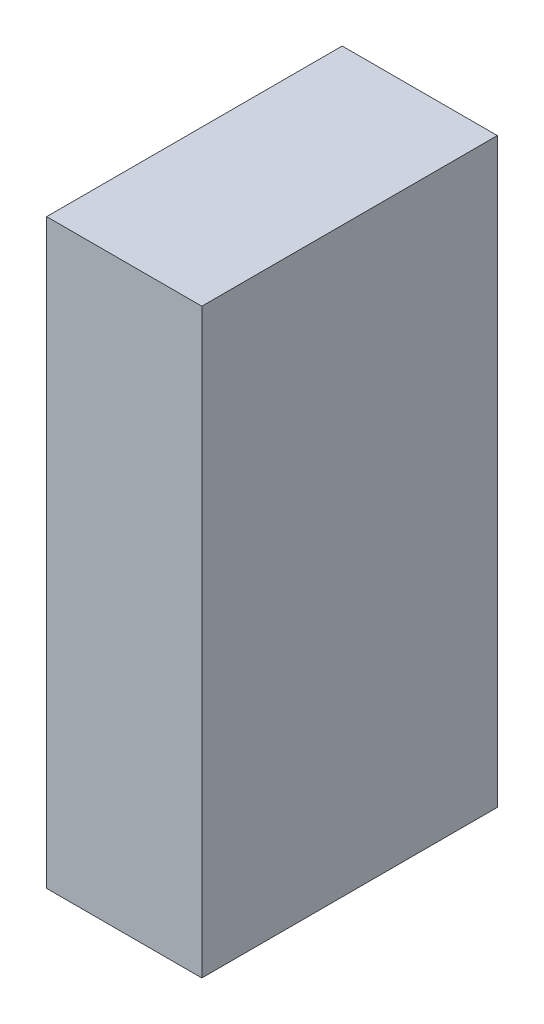
ISO-10303-21;
HEADER;
FILE_DESCRIPTION(('STEP AP214'),'2;1');
FILE_NAME('part.step','',(''),(''),'','','');
FILE_SCHEMA(('AUTOMOTIVE_DESIGN { 1 0 10303 214 1 1 1 1 }'));
ENDSEC;
DATA;
#1=APPLICATION_CONTEXT('core data for automotive mechanical design processes');
#2=APPLICATION_PROTOCOL_DEFINITION('international standard','automotive_design',2000,#1);
#3=PRODUCT_CONTEXT('',#1,'mechanical');
#4=PRODUCT('Part','Part','',(#3));
#5=PRODUCT_RELATED_PRODUCT_CATEGORY('part','',(#4));
#6=PRODUCT_DEFINITION_FORMATION('','',#4);
#7=PRODUCT_DEFINITION_CONTEXT('part definition',#1,'design');
#8=PRODUCT_DEFINITION('design','',#6,#7);
#9=PRODUCT_DEFINITION_SHAPE('','',#8);
#10=(LENGTH_UNIT() NAMED_UNIT(*) SI_UNIT(.MILLI.,.METRE.));
#11=(NAMED_UNIT(*) PLANE_ANGLE_UNIT() SI_UNIT($,.RADIAN.));
#12=(NAMED_UNIT(*) SI_UNIT($,.STERADIAN.) SOLID_ANGLE_UNIT());
#13=UNCERTAINTY_MEASURE_WITH_UNIT(LENGTH_MEASURE(1.E-05),#10,'distance_accuracy_value','');
#14=(GEOMETRIC_REPRESENTATION_CONTEXT(3) GLOBAL_UNCERTAINTY_ASSIGNED_CONTEXT((#13)) GLOBAL_UNIT_ASSIGNED_CONTEXT((#10,
#11,#12)) REPRESENTATION_CONTEXT('',''));
#15=CARTESIAN_POINT('',(0.,0.,0.));
#16=DIRECTION('',(0.,0.,1.));
#17=DIRECTION('',(1.,0.,0.));
#18=AXIS2_PLACEMENT_3D('',#15,#16,#17);
#19=CARTESIAN_POINT('',(0.,150.,0.));
#20=DIRECTION('',(1.,0.,0.));
#21=DIRECTION('',(0.,0.,-1.));
#22=AXIS2_PLACEMENT_3D('',#19,#20,#21);
#23=PLANE('',#22);
#24=DIRECTION('',(0.,0.,1.));
#25=VECTOR('',#24,1.);
#26=CARTESIAN_POINT('',(0.,0.,0.));
#27=LINE('',#26,#25);
#28=CARTESIAN_POINT('',(0.,0.,0.));
#29=VERTEX_POINT('',#28);
#30=CARTESIAN_POINT('',(0.,0.,76.2));
#31=VERTEX_POINT('',#30);
#32=EDGE_CURVE('E97',#29,#31,#27,.T.);
#33=ORIENTED_EDGE('',*,*,#32,.T.);
#34=DIRECTION('',(0.,-1.,0.));
#35=VECTOR('',#34,1.);
#36=CARTESIAN_POINT('',(0.,150.,76.2));
#37=LINE('',#36,#35);
#38=CARTESIAN_POINT('',(0.,150.,76.2));
#39=VERTEX_POINT('',#38);
#40=EDGE_CURVE('E11',#39,#31,#37,.T.);
#41=ORIENTED_EDGE('',*,*,#40,.F.);
#42=DIRECTION('',(0.,0.,1.));
#43=VECTOR('',#42,1.);
#44=CARTESIAN_POINT('',(0.,150.,0.));
#45=LINE('',#44,#43);
#46=CARTESIAN_POINT('',(0.,150.,0.));
#47=VERTEX_POINT('',#46);
#48=EDGE_CURVE('E85',#47,#39,#45,.T.);
#49=ORIENTED_EDGE('',*,*,#48,.F.);
#50=DIRECTION('',(0.,-1.,0.));
#51=VECTOR('',#50,1.);
#52=CARTESIAN_POINT('',(0.,150.,0.));
#53=LINE('',#52,#51);
#54=EDGE_CURVE('E93',#47,#29,#53,.T.);
#55=ORIENTED_EDGE('',*,*,#54,.T.);
#56=EDGE_LOOP('',(#33,#41,#49,#55));
#57=FACE_BOUND('',#56,.T.);
#58=ADVANCED_FACE('F34',(#57),#23,.F.);
#59=CARTESIAN_POINT('',(0.,150.,76.2));
#60=DIRECTION('',(0.,0.,-1.));
#61=DIRECTION('',(-1.,0.,0.));
#62=AXIS2_PLACEMENT_3D('',#59,#60,#61);
#63=PLANE('',#62);
#64=DIRECTION('',(1.,0.,0.));
#65=VECTOR('',#64,1.);
#66=CARTESIAN_POINT('',(0.,0.,76.2));
#67=LINE('',#66,#65);
#68=CARTESIAN_POINT('',(40.,0.,76.2));
#69=VERTEX_POINT('',#68);
#70=EDGE_CURVE('E89',#31,#69,#67,.T.);
#71=ORIENTED_EDGE('',*,*,#70,.T.);
#72=DIRECTION('',(0.,-1.,0.));
#73=VECTOR('',#72,1.);
#74=CARTESIAN_POINT('',(40.,150.,76.2));
#75=LINE('',#74,#73);
#76=CARTESIAN_POINT('',(40.,150.,76.2));
#77=VERTEX_POINT('',#76);
#78=EDGE_CURVE('E42',#77,#69,#75,.T.);
#79=ORIENTED_EDGE('',*,*,#78,.F.);
#80=DIRECTION('',(1.,0.,0.));
#81=VECTOR('',#80,1.);
#82=CARTESIAN_POINT('',(0.,150.,76.2));
#83=LINE('',#82,#81);
#84=EDGE_CURVE('E80',#39,#77,#83,.T.);
#85=ORIENTED_EDGE('',*,*,#84,.F.);
#86=ORIENTED_EDGE('',*,*,#40,.T.);
#87=EDGE_LOOP('',(#71,#79,#85,#86));
#88=FACE_BOUND('',#87,.T.);
#89=ADVANCED_FACE('F88',(#88),#63,.F.);
#90=CARTESIAN_POINT('',(40.,150.,0.));
#91=DIRECTION('',(-1.,0.,0.));
#92=DIRECTION('',(0.,0.,1.));
#93=AXIS2_PLACEMENT_3D('',#90,#91,#92);
#94=PLANE('',#93);
#95=DIRECTION('',(0.,0.,-1.));
#96=VECTOR('',#95,1.);
#97=CARTESIAN_POINT('',(40.,0.,0.));
#98=LINE('',#97,#96);
#99=CARTESIAN_POINT('',(40.,0.,0.));
#100=VERTEX_POINT('',#99);
#101=EDGE_CURVE('E67',#69,#100,#98,.T.);
#102=ORIENTED_EDGE('',*,*,#101,.T.);
#103=DIRECTION('',(0.,-1.,0.));
#104=VECTOR('',#103,1.);
#105=CARTESIAN_POINT('',(40.,150.,0.));
#106=LINE('',#105,#104);
#107=CARTESIAN_POINT('',(40.,150.,0.));
#108=VERTEX_POINT('',#107);
#109=EDGE_CURVE('E90',#108,#100,#106,.T.);
#110=ORIENTED_EDGE('',*,*,#109,.F.);
#111=DIRECTION('',(0.,0.,-1.));
#112=VECTOR('',#111,1.);
#113=CARTESIAN_POINT('',(40.,150.,0.));
#114=LINE('',#113,#112);
#115=EDGE_CURVE('E83',#77,#108,#114,.T.);
#116=ORIENTED_EDGE('',*,*,#115,.F.);
#117=ORIENTED_EDGE('',*,*,#78,.T.);
#118=EDGE_LOOP('',(#102,#110,#116,#117));
#119=FACE_BOUND('',#118,.T.);
#120=ADVANCED_FACE('F91',(#119),#94,.F.);
#121=CARTESIAN_POINT('',(0.,150.,0.));
#122=DIRECTION('',(0.,0.,1.));
#123=DIRECTION('',(1.,0.,0.));
#124=AXIS2_PLACEMENT_3D('',#121,#122,#123);
#125=PLANE('',#124);
#126=DIRECTION('',(-1.,0.,0.));
#127=VECTOR('',#126,1.);
#128=CARTESIAN_POINT('',(0.,0.,0.));
#129=LINE('',#128,#127);
#130=EDGE_CURVE('E73',#100,#29,#129,.T.);
#131=ORIENTED_EDGE('',*,*,#130,.T.);
#132=ORIENTED_EDGE('',*,*,#54,.F.);
#133=DIRECTION('',(-1.,0.,0.));
#134=VECTOR('',#133,1.);
#135=CARTESIAN_POINT('',(0.,150.,0.));
#136=LINE('',#135,#134);
#137=EDGE_CURVE('E50',#108,#47,#136,.T.);
#138=ORIENTED_EDGE('',*,*,#137,.F.);
#139=ORIENTED_EDGE('',*,*,#109,.T.);
#140=EDGE_LOOP('',(#131,#132,#138,#139));
#141=FACE_BOUND('',#140,.T.);
#142=ADVANCED_FACE('F104',(#141),#125,.F.);
#143=CARTESIAN_POINT('',(0.,150.,0.));
#144=DIRECTION('',(0.,1.,0.));
#145=DIRECTION('',(0.,0.,1.));
#146=AXIS2_PLACEMENT_3D('',#143,#144,#145);
#147=PLANE('',#146);
#148=ORIENTED_EDGE('',*,*,#48,.T.);
#149=ORIENTED_EDGE('',*,*,#84,.T.);
#150=ORIENTED_EDGE('',*,*,#115,.T.);
#151=ORIENTED_EDGE('',*,*,#137,.T.);
#152=EDGE_LOOP('',(#148,#149,#150,#151));
#153=FACE_BOUND('',#152,.T.);
#154=ADVANCED_FACE('F81',(#153),#147,.T.);
#155=CARTESIAN_POINT('',(0.,0.,0.));
#156=DIRECTION('',(0.,1.,0.));
#157=DIRECTION('',(0.,0.,1.));
#158=AXIS2_PLACEMENT_3D('',#155,#156,#157);
#159=PLANE('',#158);
#160=ORIENTED_EDGE('',*,*,#32,.F.);
#161=ORIENTED_EDGE('',*,*,#130,.F.);
#162=ORIENTED_EDGE('',*,*,#101,.F.);
#163=ORIENTED_EDGE('',*,*,#70,.F.);
#164=EDGE_LOOP('',(#160,#161,#162,#163));
#165=FACE_BOUND('',#164,.T.);
#166=ADVANCED_FACE('F107',(#165),#159,.F.);
#167=CLOSED_SHELL('',(#58,#89,#120,#142,#154,#166));
#168=MANIFOLD_SOLID_BREP('B2',#167);
#169=ADVANCED_BREP_SHAPE_REPRESENTATION('',(#18,#168),#14);
#170=SHAPE_DEFINITION_REPRESENTATION(#9,#169);
ENDSEC;
END-ISO-10303-21;
